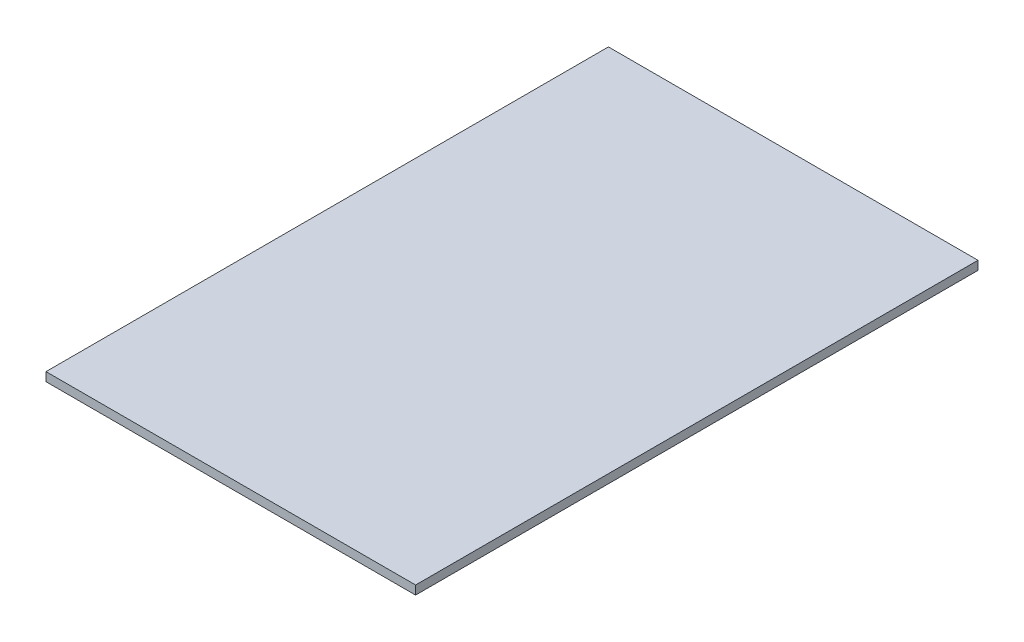
ISO-10303-21;
HEADER;
FILE_DESCRIPTION(('STEP AP214'),'2;1');
FILE_NAME('part.step','',(''),(''),'','','');
FILE_SCHEMA(('AUTOMOTIVE_DESIGN { 1 0 10303 214 1 1 1 1 }'));
ENDSEC;
DATA;
#1=APPLICATION_CONTEXT('core data for automotive mechanical design processes');
#2=APPLICATION_PROTOCOL_DEFINITION('international standard','automotive_design',2000,#1);
#3=PRODUCT_CONTEXT('',#1,'mechanical');
#4=PRODUCT('Part','Part','',(#3));
#5=PRODUCT_RELATED_PRODUCT_CATEGORY('part','',(#4));
#6=PRODUCT_DEFINITION_FORMATION('','',#4);
#7=PRODUCT_DEFINITION_CONTEXT('part definition',#1,'design');
#8=PRODUCT_DEFINITION('design','',#6,#7);
#9=PRODUCT_DEFINITION_SHAPE('','',#8);
#10=(LENGTH_UNIT() NAMED_UNIT(*) SI_UNIT(.MILLI.,.METRE.));
#11=(NAMED_UNIT(*) PLANE_ANGLE_UNIT() SI_UNIT($,.RADIAN.));
#12=(NAMED_UNIT(*) SI_UNIT($,.STERADIAN.) SOLID_ANGLE_UNIT());
#13=UNCERTAINTY_MEASURE_WITH_UNIT(LENGTH_MEASURE(1.E-05),#10,'distance_accuracy_value','');
#14=(GEOMETRIC_REPRESENTATION_CONTEXT(3) GLOBAL_UNCERTAINTY_ASSIGNED_CONTEXT((#13)) GLOBAL_UNIT_ASSIGNED_CONTEXT((#10,
#11,#12)) REPRESENTATION_CONTEXT('',''));
#15=CARTESIAN_POINT('',(0.,0.,0.));
#16=DIRECTION('',(0.,0.,1.));
#17=DIRECTION('',(1.,0.,0.));
#18=AXIS2_PLACEMENT_3D('',#15,#16,#17);
#19=CARTESIAN_POINT('',(63.25,3.,96.25));
#20=DIRECTION('',(0.,0.,-1.));
#21=DIRECTION('',(-1.,0.,0.));
#22=AXIS2_PLACEMENT_3D('',#19,#20,#21);
#23=PLANE('',#22);
#24=DIRECTION('',(1.,0.,0.));
#25=VECTOR('',#24,1.);
#26=CARTESIAN_POINT('',(63.25,0.,96.25));
#27=LINE('',#26,#25);
#28=CARTESIAN_POINT('',(-63.25,0.,96.25));
#29=VERTEX_POINT('',#28);
#30=CARTESIAN_POINT('',(63.25,0.,96.25));
#31=VERTEX_POINT('',#30);
#32=EDGE_CURVE('E98',#29,#31,#27,.T.);
#33=ORIENTED_EDGE('',*,*,#32,.T.);
#34=DIRECTION('',(0.,-1.,0.));
#35=VECTOR('',#34,1.);
#36=CARTESIAN_POINT('',(63.25,3.,96.25));
#37=LINE('',#36,#35);
#38=CARTESIAN_POINT('',(63.25,3.,96.25));
#39=VERTEX_POINT('',#38);
#40=EDGE_CURVE('E11',#39,#31,#37,.T.);
#41=ORIENTED_EDGE('',*,*,#40,.F.);
#42=DIRECTION('',(1.,0.,0.));
#43=VECTOR('',#42,1.);
#44=CARTESIAN_POINT('',(63.25,3.,96.25));
#45=LINE('',#44,#43);
#46=CARTESIAN_POINT('',(-63.25,3.,96.25));
#47=VERTEX_POINT('',#46);
#48=EDGE_CURVE('E86',#47,#39,#45,.T.);
#49=ORIENTED_EDGE('',*,*,#48,.F.);
#50=DIRECTION('',(0.,-1.,0.));
#51=VECTOR('',#50,1.);
#52=CARTESIAN_POINT('',(-63.25,3.,96.25));
#53=LINE('',#52,#51);
#54=EDGE_CURVE('E94',#47,#29,#53,.T.);
#55=ORIENTED_EDGE('',*,*,#54,.T.);
#56=EDGE_LOOP('',(#33,#41,#49,#55));
#57=FACE_BOUND('',#56,.T.);
#58=ADVANCED_FACE('F35',(#57),#23,.F.);
#59=CARTESIAN_POINT('',(63.25,3.,96.25));
#60=DIRECTION('',(-1.,0.,0.));
#61=DIRECTION('',(0.,0.,1.));
#62=AXIS2_PLACEMENT_3D('',#59,#60,#61);
#63=PLANE('',#62);
#64=DIRECTION('',(0.,0.,-1.));
#65=VECTOR('',#64,1.);
#66=CARTESIAN_POINT('',(63.25,0.,96.25));
#67=LINE('',#66,#65);
#68=CARTESIAN_POINT('',(63.25,0.,-96.25));
#69=VERTEX_POINT('',#68);
#70=EDGE_CURVE('E90',#31,#69,#67,.T.);
#71=ORIENTED_EDGE('',*,*,#70,.T.);
#72=DIRECTION('',(0.,-1.,0.));
#73=VECTOR('',#72,1.);
#74=CARTESIAN_POINT('',(63.25,3.,-96.25));
#75=LINE('',#74,#73);
#76=CARTESIAN_POINT('',(63.25,3.,-96.25));
#77=VERTEX_POINT('',#76);
#78=EDGE_CURVE('E43',#77,#69,#75,.T.);
#79=ORIENTED_EDGE('',*,*,#78,.F.);
#80=DIRECTION('',(0.,0.,-1.));
#81=VECTOR('',#80,1.);
#82=CARTESIAN_POINT('',(63.25,3.,96.25));
#83=LINE('',#82,#81);
#84=EDGE_CURVE('E81',#39,#77,#83,.T.);
#85=ORIENTED_EDGE('',*,*,#84,.F.);
#86=ORIENTED_EDGE('',*,*,#40,.T.);
#87=EDGE_LOOP('',(#71,#79,#85,#86));
#88=FACE_BOUND('',#87,.T.);
#89=ADVANCED_FACE('F89',(#88),#63,.F.);
#90=CARTESIAN_POINT('',(63.25,3.,-96.25));
#91=DIRECTION('',(0.,0.,1.));
#92=DIRECTION('',(1.,0.,0.));
#93=AXIS2_PLACEMENT_3D('',#90,#91,#92);
#94=PLANE('',#93);
#95=DIRECTION('',(-1.,0.,0.));
#96=VECTOR('',#95,1.);
#97=CARTESIAN_POINT('',(63.25,0.,-96.25));
#98=LINE('',#97,#96);
#99=CARTESIAN_POINT('',(-63.25,0.,-96.25));
#100=VERTEX_POINT('',#99);
#101=EDGE_CURVE('E68',#69,#100,#98,.T.);
#102=ORIENTED_EDGE('',*,*,#101,.T.);
#103=DIRECTION('',(0.,-1.,0.));
#104=VECTOR('',#103,1.);
#105=CARTESIAN_POINT('',(-63.25,3.,-96.25));
#106=LINE('',#105,#104);
#107=CARTESIAN_POINT('',(-63.25,3.,-96.25));
#108=VERTEX_POINT('',#107);
#109=EDGE_CURVE('E91',#108,#100,#106,.T.);
#110=ORIENTED_EDGE('',*,*,#109,.F.);
#111=DIRECTION('',(-1.,0.,0.));
#112=VECTOR('',#111,1.);
#113=CARTESIAN_POINT('',(63.25,3.,-96.25));
#114=LINE('',#113,#112);
#115=EDGE_CURVE('E84',#77,#108,#114,.T.);
#116=ORIENTED_EDGE('',*,*,#115,.F.);
#117=ORIENTED_EDGE('',*,*,#78,.T.);
#118=EDGE_LOOP('',(#102,#110,#116,#117));
#119=FACE_BOUND('',#118,.T.);
#120=ADVANCED_FACE('F92',(#119),#94,.F.);
#121=CARTESIAN_POINT('',(-63.25,3.,96.25));
#122=DIRECTION('',(1.,0.,0.));
#123=DIRECTION('',(0.,0.,-1.));
#124=AXIS2_PLACEMENT_3D('',#121,#122,#123);
#125=PLANE('',#124);
#126=DIRECTION('',(0.,0.,1.));
#127=VECTOR('',#126,1.);
#128=CARTESIAN_POINT('',(-63.25,0.,96.25));
#129=LINE('',#128,#127);
#130=EDGE_CURVE('E74',#100,#29,#129,.T.);
#131=ORIENTED_EDGE('',*,*,#130,.T.);
#132=ORIENTED_EDGE('',*,*,#54,.F.);
#133=DIRECTION('',(0.,0.,1.));
#134=VECTOR('',#133,1.);
#135=CARTESIAN_POINT('',(-63.25,3.,96.25));
#136=LINE('',#135,#134);
#137=EDGE_CURVE('E51',#108,#47,#136,.T.);
#138=ORIENTED_EDGE('',*,*,#137,.F.);
#139=ORIENTED_EDGE('',*,*,#109,.T.);
#140=EDGE_LOOP('',(#131,#132,#138,#139));
#141=FACE_BOUND('',#140,.T.);
#142=ADVANCED_FACE('F105',(#141),#125,.F.);
#143=CARTESIAN_POINT('',(0.,3.,0.));
#144=DIRECTION('',(0.,-1.,0.));
#145=DIRECTION('',(0.,0.,-1.));
#146=AXIS2_PLACEMENT_3D('',#143,#144,#145);
#147=PLANE('',#146);
#148=ORIENTED_EDGE('',*,*,#48,.T.);
#149=ORIENTED_EDGE('',*,*,#84,.T.);
#150=ORIENTED_EDGE('',*,*,#115,.T.);
#151=ORIENTED_EDGE('',*,*,#137,.T.);
#152=EDGE_LOOP('',(#148,#149,#150,#151));
#153=FACE_BOUND('',#152,.T.);
#154=ADVANCED_FACE('F82',(#153),#147,.F.);
#155=CARTESIAN_POINT('',(0.,0.,0.));
#156=DIRECTION('',(0.,-1.,0.));
#157=DIRECTION('',(0.,0.,-1.));
#158=AXIS2_PLACEMENT_3D('',#155,#156,#157);
#159=PLANE('',#158);
#160=ORIENTED_EDGE('',*,*,#32,.F.);
#161=ORIENTED_EDGE('',*,*,#130,.F.);
#162=ORIENTED_EDGE('',*,*,#101,.F.);
#163=ORIENTED_EDGE('',*,*,#70,.F.);
#164=EDGE_LOOP('',(#160,#161,#162,#163));
#165=FACE_BOUND('',#164,.T.);
#166=ADVANCED_FACE('F108',(#165),#159,.T.);
#167=CLOSED_SHELL('',(#58,#89,#120,#142,#154,#166));
#168=MANIFOLD_SOLID_BREP('B2',#167);
#169=ADVANCED_BREP_SHAPE_REPRESENTATION('',(#18,#168),#14);
#170=SHAPE_DEFINITION_REPRESENTATION(#9,#169);
ENDSEC;
END-ISO-10303-21;
